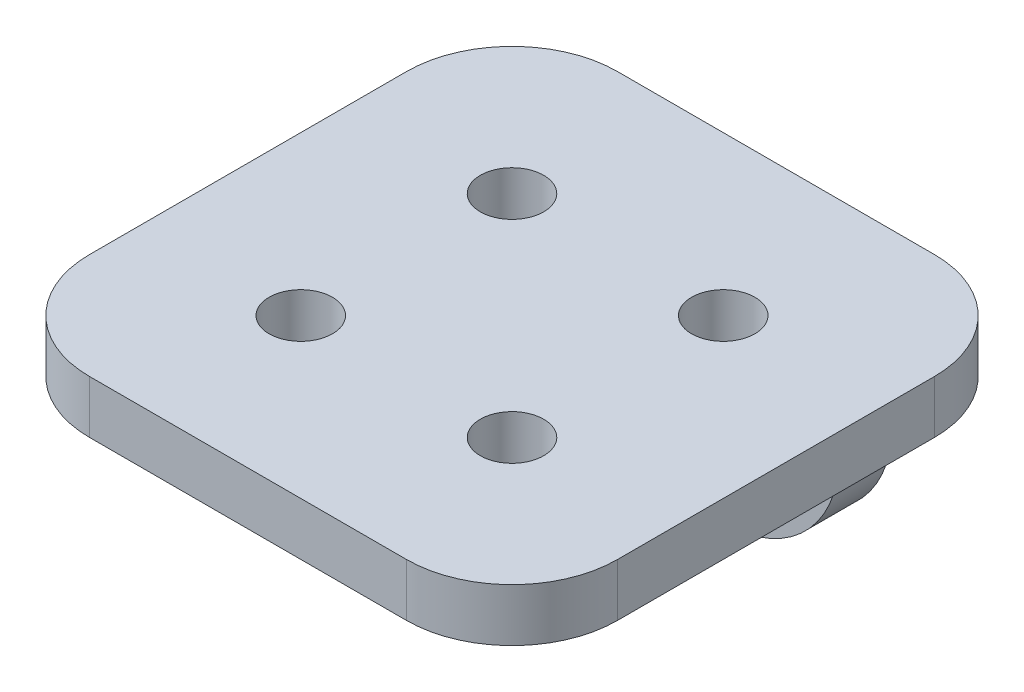
ISO-10303-21;
HEADER;
FILE_DESCRIPTION(('STEP AP214'),'2;1');
FILE_NAME('part.step','',(''),(''),'','','');
FILE_SCHEMA(('AUTOMOTIVE_DESIGN { 1 0 10303 214 1 1 1 1 }'));
ENDSEC;
DATA;
#1=APPLICATION_CONTEXT('core data for automotive mechanical design processes');
#2=APPLICATION_PROTOCOL_DEFINITION('international standard','automotive_design',2000,#1);
#3=PRODUCT_CONTEXT('',#1,'mechanical');
#4=PRODUCT('Part','Part','',(#3));
#5=PRODUCT_RELATED_PRODUCT_CATEGORY('part','',(#4));
#6=PRODUCT_DEFINITION_FORMATION('','',#4);
#7=PRODUCT_DEFINITION_CONTEXT('part definition',#1,'design');
#8=PRODUCT_DEFINITION('design','',#6,#7);
#9=PRODUCT_DEFINITION_SHAPE('','',#8);
#10=(LENGTH_UNIT() NAMED_UNIT(*) SI_UNIT(.MILLI.,.METRE.));
#11=(NAMED_UNIT(*) PLANE_ANGLE_UNIT() SI_UNIT($,.RADIAN.));
#12=(NAMED_UNIT(*) SI_UNIT($,.STERADIAN.) SOLID_ANGLE_UNIT());
#13=UNCERTAINTY_MEASURE_WITH_UNIT(LENGTH_MEASURE(1.E-05),#10,'distance_accuracy_value','');
#14=(GEOMETRIC_REPRESENTATION_CONTEXT(3) GLOBAL_UNCERTAINTY_ASSIGNED_CONTEXT((#13)) GLOBAL_UNIT_ASSIGNED_CONTEXT((#10,
#11,#12)) REPRESENTATION_CONTEXT('',''));
#15=CARTESIAN_POINT('',(0.,0.,0.));
#16=DIRECTION('',(0.,0.,1.));
#17=DIRECTION('',(1.,0.,0.));
#18=AXIS2_PLACEMENT_3D('',#15,#16,#17);
#19=CARTESIAN_POINT('',(0.,0.,5.));
#20=DIRECTION('',(0.,0.,-1.));
#21=DIRECTION('',(-1.,0.,0.));
#22=AXIS2_PLACEMENT_3D('',#19,#20,#21);
#23=CYLINDRICAL_SURFACE('',#22,5.);
#24=CARTESIAN_POINT('',(0.,0.,5.));
#25=DIRECTION('',(0.,0.,1.));
#26=DIRECTION('',(1.,0.,0.));
#27=AXIS2_PLACEMENT_3D('',#24,#25,#26);
#28=CIRCLE('',#27,5.);
#29=CARTESIAN_POINT('',(5.,0.,5.));
#30=VERTEX_POINT('',#29);
#31=EDGE_CURVE('E166',#30,#30,#28,.T.);
#32=ORIENTED_EDGE('',*,*,#31,.T.);
#33=EDGE_LOOP('',(#32));
#34=FACE_BOUND('',#33,.T.);
#35=CARTESIAN_POINT('',(0.,0.,0.));
#36=DIRECTION('',(0.,0.,1.));
#37=DIRECTION('',(1.,0.,0.));
#38=AXIS2_PLACEMENT_3D('',#35,#36,#37);
#39=CIRCLE('',#38,5.);
#40=CARTESIAN_POINT('',(5.,0.,0.));
#41=VERTEX_POINT('',#40);
#42=EDGE_CURVE('E242',#41,#41,#39,.T.);
#43=ORIENTED_EDGE('',*,*,#42,.F.);
#44=EDGE_LOOP('',(#43));
#45=FACE_BOUND('',#44,.T.);
#46=ADVANCED_FACE('F41',(#34,#45),#23,.F.);
#47=CARTESIAN_POINT('',(0.,8.,5.));
#48=DIRECTION('',(0.,0.,-1.));
#49=DIRECTION('',(-1.,0.,0.));
#50=AXIS2_PLACEMENT_3D('',#47,#48,#49);
#51=CYLINDRICAL_SURFACE('',#50,2.);
#52=CARTESIAN_POINT('',(0.,8.,5.));
#53=DIRECTION('',(0.,0.,1.));
#54=DIRECTION('',(1.,0.,0.));
#55=AXIS2_PLACEMENT_3D('',#52,#53,#54);
#56=CIRCLE('',#55,2.);
#57=CARTESIAN_POINT('',(2.,8.,5.));
#58=VERTEX_POINT('',#57);
#59=EDGE_CURVE('E220',#58,#58,#56,.T.);
#60=ORIENTED_EDGE('',*,*,#59,.T.);
#61=EDGE_LOOP('',(#60));
#62=FACE_BOUND('',#61,.T.);
#63=CARTESIAN_POINT('',(0.,8.,0.));
#64=DIRECTION('',(0.,0.,1.));
#65=DIRECTION('',(1.,0.,0.));
#66=AXIS2_PLACEMENT_3D('',#63,#64,#65);
#67=CIRCLE('',#66,2.);
#68=CARTESIAN_POINT('',(2.,8.,0.));
#69=VERTEX_POINT('',#68);
#70=EDGE_CURVE('E238',#69,#69,#67,.T.);
#71=ORIENTED_EDGE('',*,*,#70,.F.);
#72=EDGE_LOOP('',(#71));
#73=FACE_BOUND('',#72,.T.);
#74=ADVANCED_FACE('F361',(#62,#73),#51,.F.);
#75=CARTESIAN_POINT('',(8.,0.,5.));
#76=DIRECTION('',(0.,0.,-1.));
#77=DIRECTION('',(-1.,0.,0.));
#78=AXIS2_PLACEMENT_3D('',#75,#76,#77);
#79=CYLINDRICAL_SURFACE('',#78,2.00000000000003);
#80=CARTESIAN_POINT('',(8.,0.,5.));
#81=DIRECTION('',(0.,0.,1.));
#82=DIRECTION('',(1.,0.,0.));
#83=AXIS2_PLACEMENT_3D('',#80,#81,#82);
#84=CIRCLE('',#83,2.00000000000003);
#85=CARTESIAN_POINT('',(10.,0.,5.));
#86=VERTEX_POINT('',#85);
#87=EDGE_CURVE('E216',#86,#86,#84,.T.);
#88=ORIENTED_EDGE('',*,*,#87,.T.);
#89=EDGE_LOOP('',(#88));
#90=FACE_BOUND('',#89,.T.);
#91=CARTESIAN_POINT('',(8.,0.,0.));
#92=DIRECTION('',(0.,0.,1.));
#93=DIRECTION('',(1.,0.,0.));
#94=AXIS2_PLACEMENT_3D('',#91,#92,#93);
#95=CIRCLE('',#94,2.00000000000003);
#96=CARTESIAN_POINT('',(10.,0.,0.));
#97=VERTEX_POINT('',#96);
#98=EDGE_CURVE('E234',#97,#97,#95,.T.);
#99=ORIENTED_EDGE('',*,*,#98,.F.);
#100=EDGE_LOOP('',(#99));
#101=FACE_BOUND('',#100,.T.);
#102=ADVANCED_FACE('F367',(#90,#101),#79,.F.);
#103=CARTESIAN_POINT('',(0.,-8.,5.));
#104=DIRECTION('',(0.,0.,-1.));
#105=DIRECTION('',(-1.,0.,0.));
#106=AXIS2_PLACEMENT_3D('',#103,#104,#105);
#107=CYLINDRICAL_SURFACE('',#106,2.00000000000005);
#108=CARTESIAN_POINT('',(0.,-8.,5.));
#109=DIRECTION('',(0.,0.,1.));
#110=DIRECTION('',(1.,0.,0.));
#111=AXIS2_PLACEMENT_3D('',#108,#109,#110);
#112=CIRCLE('',#111,2.00000000000005);
#113=CARTESIAN_POINT('',(2.00000000000006,-8.,5.));
#114=VERTEX_POINT('',#113);
#115=EDGE_CURVE('E211',#114,#114,#112,.T.);
#116=ORIENTED_EDGE('',*,*,#115,.T.);
#117=EDGE_LOOP('',(#116));
#118=FACE_BOUND('',#117,.T.);
#119=CARTESIAN_POINT('',(0.,-8.,0.));
#120=DIRECTION('',(0.,0.,1.));
#121=DIRECTION('',(1.,0.,0.));
#122=AXIS2_PLACEMENT_3D('',#119,#120,#121);
#123=CIRCLE('',#122,2.00000000000005);
#124=CARTESIAN_POINT('',(2.00000000000006,-8.,0.));
#125=VERTEX_POINT('',#124);
#126=EDGE_CURVE('E230',#125,#125,#123,.T.);
#127=ORIENTED_EDGE('',*,*,#126,.F.);
#128=EDGE_LOOP('',(#127));
#129=FACE_BOUND('',#128,.T.);
#130=ADVANCED_FACE('F377',(#118,#129),#107,.F.);
#131=CARTESIAN_POINT('',(-8.,0.,5.));
#132=DIRECTION('',(0.,0.,-1.));
#133=DIRECTION('',(-1.,0.,0.));
#134=AXIS2_PLACEMENT_3D('',#131,#132,#133);
#135=CYLINDRICAL_SURFACE('',#134,2.00000000000008);
#136=CARTESIAN_POINT('',(-8.,0.,5.));
#137=DIRECTION('',(0.,0.,1.));
#138=DIRECTION('',(1.,0.,0.));
#139=AXIS2_PLACEMENT_3D('',#136,#137,#138);
#140=CIRCLE('',#139,2.00000000000008);
#141=CARTESIAN_POINT('',(-5.99999999999992,0.,5.));
#142=VERTEX_POINT('',#141);
#143=EDGE_CURVE('E207',#142,#142,#140,.T.);
#144=ORIENTED_EDGE('',*,*,#143,.T.);
#145=EDGE_LOOP('',(#144));
#146=FACE_BOUND('',#145,.T.);
#147=CARTESIAN_POINT('',(-8.,0.,0.));
#148=DIRECTION('',(0.,0.,1.));
#149=DIRECTION('',(1.,0.,0.));
#150=AXIS2_PLACEMENT_3D('',#147,#148,#149);
#151=CIRCLE('',#150,2.00000000000008);
#152=CARTESIAN_POINT('',(-5.99999999999992,0.,0.));
#153=VERTEX_POINT('',#152);
#154=EDGE_CURVE('E206',#153,#153,#151,.T.);
#155=ORIENTED_EDGE('',*,*,#154,.F.);
#156=EDGE_LOOP('',(#155));
#157=FACE_BOUND('',#156,.T.);
#158=ADVANCED_FACE('F381',(#146,#157),#135,.F.);
#159=CARTESIAN_POINT('',(0.,0.,5.));
#160=DIRECTION('',(0.,0.,-1.));
#161=DIRECTION('',(-1.,0.,0.));
#162=AXIS2_PLACEMENT_3D('',#159,#160,#161);
#163=CYLINDRICAL_SURFACE('',#162,11.);
#164=CARTESIAN_POINT('',(0.,0.,0.));
#165=DIRECTION('',(0.,0.,1.));
#166=DIRECTION('',(1.,0.,0.));
#167=AXIS2_PLACEMENT_3D('',#164,#165,#166);
#168=CIRCLE('',#167,11.);
#169=CARTESIAN_POINT('',(-11.,0.,0.));
#170=VERTEX_POINT('',#169);
#171=CARTESIAN_POINT('',(11.,0.,0.));
#172=VERTEX_POINT('',#171);
#173=EDGE_CURVE('E212',#170,#172,#168,.T.);
#174=ORIENTED_EDGE('',*,*,#173,.T.);
#175=DIRECTION('',(0.,0.,-1.));
#176=VECTOR('',#175,1.);
#177=CARTESIAN_POINT('',(11.,0.,5.));
#178=LINE('',#177,#176);
#179=CARTESIAN_POINT('',(11.,0.,5.));
#180=VERTEX_POINT('',#179);
#181=EDGE_CURVE('E139',#180,#172,#178,.T.);
#182=ORIENTED_EDGE('',*,*,#181,.F.);
#183=CARTESIAN_POINT('',(0.,0.,5.));
#184=DIRECTION('',(0.,0.,1.));
#185=DIRECTION('',(1.,0.,0.));
#186=AXIS2_PLACEMENT_3D('',#183,#184,#185);
#187=CIRCLE('',#186,11.);
#188=CARTESIAN_POINT('',(-11.,0.,5.));
#189=VERTEX_POINT('',#188);
#190=EDGE_CURVE('E149',#189,#180,#187,.T.);
#191=ORIENTED_EDGE('',*,*,#190,.F.);
#192=DIRECTION('',(0.,0.,-1.));
#193=VECTOR('',#192,1.);
#194=CARTESIAN_POINT('',(-11.,0.,5.));
#195=LINE('',#194,#193);
#196=EDGE_CURVE('E174',#189,#170,#195,.T.);
#197=ORIENTED_EDGE('',*,*,#196,.T.);
#198=EDGE_LOOP('',(#174,#182,#191,#197));
#199=FACE_BOUND('',#198,.T.);
#200=ADVANCED_FACE('F372',(#199),#163,.T.);
#201=CARTESIAN_POINT('',(0.,0.,5.));
#202=DIRECTION('',(0.,0.,1.));
#203=DIRECTION('',(1.,0.,0.));
#204=AXIS2_PLACEMENT_3D('',#201,#202,#203);
#205=PLANE('',#204);
#206=DIRECTION('',(1.,0.,0.));
#207=VECTOR('',#206,1.);
#208=CARTESIAN_POINT('',(25.,11.,5.));
#209=LINE('',#208,#207);
#210=CARTESIAN_POINT('',(-15.,11.,5.));
#211=VERTEX_POINT('',#210);
#212=CARTESIAN_POINT('',(15.,11.,5.));
#213=VERTEX_POINT('',#212);
#214=EDGE_CURVE('E147',#211,#213,#209,.T.);
#215=ORIENTED_EDGE('',*,*,#214,.F.);
#216=DIRECTION('',(0.341743063086705,-0.939793423488437,0.));
#217=VECTOR('',#216,1.);
#218=CARTESIAN_POINT('',(-9.71532846715328,-3.53284671532847,5.));
#219=LINE('',#218,#217);
#220=EDGE_CURVE('E151',#211,#189,#219,.T.);
#221=ORIENTED_EDGE('',*,*,#220,.T.);
#222=ORIENTED_EDGE('',*,*,#190,.T.);
#223=DIRECTION('',(-0.341743063086704,-0.939793423488437,0.));
#224=VECTOR('',#223,1.);
#225=CARTESIAN_POINT('',(9.71532846715328,-3.53284671532847,5.));
#226=LINE('',#225,#224);
#227=EDGE_CURVE('E133',#213,#180,#226,.T.);
#228=ORIENTED_EDGE('',*,*,#227,.F.);
#229=EDGE_LOOP('',(#215,#221,#222,#228));
#230=FACE_BOUND('',#229,.T.);
#231=ORIENTED_EDGE('',*,*,#143,.F.);
#232=EDGE_LOOP('',(#231));
#233=FACE_BOUND('',#232,.T.);
#234=ORIENTED_EDGE('',*,*,#115,.F.);
#235=EDGE_LOOP('',(#234));
#236=FACE_BOUND('',#235,.T.);
#237=ORIENTED_EDGE('',*,*,#87,.F.);
#238=EDGE_LOOP('',(#237));
#239=FACE_BOUND('',#238,.T.);
#240=ORIENTED_EDGE('',*,*,#59,.F.);
#241=EDGE_LOOP('',(#240));
#242=FACE_BOUND('',#241,.T.);
#243=ORIENTED_EDGE('',*,*,#31,.F.);
#244=EDGE_LOOP('',(#243));
#245=FACE_BOUND('',#244,.T.);
#246=ADVANCED_FACE('F144',(#230,#233,#236,#239,#242,#245),#205,.T.);
#247=CARTESIAN_POINT('',(0.,0.,0.));
#248=DIRECTION('',(0.,0.,1.));
#249=DIRECTION('',(1.,0.,0.));
#250=AXIS2_PLACEMENT_3D('',#247,#248,#249);
#251=PLANE('',#250);
#252=ORIENTED_EDGE('',*,*,#154,.T.);
#253=EDGE_LOOP('',(#252));
#254=FACE_BOUND('',#253,.T.);
#255=ORIENTED_EDGE('',*,*,#126,.T.);
#256=EDGE_LOOP('',(#255));
#257=FACE_BOUND('',#256,.T.);
#258=ORIENTED_EDGE('',*,*,#98,.T.);
#259=EDGE_LOOP('',(#258));
#260=FACE_BOUND('',#259,.T.);
#261=ORIENTED_EDGE('',*,*,#70,.T.);
#262=EDGE_LOOP('',(#261));
#263=FACE_BOUND('',#262,.T.);
#264=ORIENTED_EDGE('',*,*,#42,.T.);
#265=EDGE_LOOP('',(#264));
#266=FACE_BOUND('',#265,.T.);
#267=DIRECTION('',(1.,0.,0.));
#268=VECTOR('',#267,1.);
#269=CARTESIAN_POINT('',(0.,16.,0.));
#270=LINE('',#269,#268);
#271=CARTESIAN_POINT('',(-15.,16.,0.));
#272=VERTEX_POINT('',#271);
#273=CARTESIAN_POINT('',(15.,16.,0.));
#274=VERTEX_POINT('',#273);
#275=EDGE_CURVE('E177',#272,#274,#270,.T.);
#276=ORIENTED_EDGE('',*,*,#275,.T.);
#277=DIRECTION('',(0.,-1.,0.));
#278=VECTOR('',#277,1.);
#279=CARTESIAN_POINT('',(15.,11.,0.));
#280=LINE('',#279,#278);
#281=CARTESIAN_POINT('',(15.,11.,0.));
#282=VERTEX_POINT('',#281);
#283=EDGE_CURVE('E164',#274,#282,#280,.T.);
#284=ORIENTED_EDGE('',*,*,#283,.T.);
#285=DIRECTION('',(-0.341743063086704,-0.939793423488437,0.));
#286=VECTOR('',#285,1.);
#287=CARTESIAN_POINT('',(9.71532846715328,-3.53284671532847,0.));
#288=LINE('',#287,#286);
#289=EDGE_CURVE('E135',#282,#172,#288,.T.);
#290=ORIENTED_EDGE('',*,*,#289,.T.);
#291=ORIENTED_EDGE('',*,*,#173,.F.);
#292=DIRECTION('',(0.341743063086705,-0.939793423488437,0.));
#293=VECTOR('',#292,1.);
#294=CARTESIAN_POINT('',(-9.71532846715328,-3.53284671532847,0.));
#295=LINE('',#294,#293);
#296=CARTESIAN_POINT('',(-15.,11.,0.));
#297=VERTEX_POINT('',#296);
#298=EDGE_CURVE('E152',#297,#170,#295,.T.);
#299=ORIENTED_EDGE('',*,*,#298,.F.);
#300=DIRECTION('',(0.,1.,0.));
#301=VECTOR('',#300,1.);
#302=CARTESIAN_POINT('',(-15.,16.,0.));
#303=LINE('',#302,#301);
#304=EDGE_CURVE('E159',#297,#272,#303,.T.);
#305=ORIENTED_EDGE('',*,*,#304,.T.);
#306=EDGE_LOOP('',(#276,#284,#290,#291,#299,#305));
#307=FACE_BOUND('',#306,.T.);
#308=ADVANCED_FACE('F356',(#254,#257,#260,#263,#266,#307),#251,.F.);
#309=CARTESIAN_POINT('',(9.71532846715328,-3.53284671532847,5.));
#310=DIRECTION('',(0.939793423488437,-0.341743063086704,0.));
#311=DIRECTION('',(0.341743063086704,0.939793423488437,0.));
#312=AXIS2_PLACEMENT_3D('',#309,#310,#311);
#313=PLANE('',#312);
#314=ORIENTED_EDGE('',*,*,#289,.F.);
#315=DIRECTION('',(0.,0.,-1.));
#316=VECTOR('',#315,1.);
#317=CARTESIAN_POINT('',(15.,11.,5.));
#318=LINE('',#317,#316);
#319=EDGE_CURVE('E129',#213,#282,#318,.T.);
#320=ORIENTED_EDGE('',*,*,#319,.F.);
#321=ORIENTED_EDGE('',*,*,#227,.T.);
#322=ORIENTED_EDGE('',*,*,#181,.T.);
#323=EDGE_LOOP('',(#314,#320,#321,#322));
#324=FACE_BOUND('',#323,.T.);
#325=ADVANCED_FACE('F131',(#324),#313,.T.);
#326=CARTESIAN_POINT('',(0.,11.,5.));
#327=DIRECTION('',(0.,1.,0.));
#328=DIRECTION('',(0.,0.,1.));
#329=AXIS2_PLACEMENT_3D('',#326,#327,#328);
#330=PLANE('',#329);
#331=CARTESIAN_POINT('',(10.,11.,15.));
#332=DIRECTION('',(0.,1.,0.));
#333=DIRECTION('',(0.,0.,1.));
#334=AXIS2_PLACEMENT_3D('',#331,#332,#333);
#335=CIRCLE('',#334,3.);
#336=CARTESIAN_POINT('',(10.,11.,18.));
#337=VERTEX_POINT('',#336);
#338=EDGE_CURVE('E306',#337,#337,#335,.F.);
#339=ORIENTED_EDGE('',*,*,#338,.F.);
#340=EDGE_LOOP('',(#339));
#341=FACE_BOUND('',#340,.T.);
#342=CARTESIAN_POINT('',(-10.,11.,15.));
#343=DIRECTION('',(0.,1.,0.));
#344=DIRECTION('',(0.,0.,1.));
#345=AXIS2_PLACEMENT_3D('',#342,#343,#344);
#346=CIRCLE('',#345,3.);
#347=CARTESIAN_POINT('',(-10.,11.,18.));
#348=VERTEX_POINT('',#347);
#349=EDGE_CURVE('E315',#348,#348,#346,.F.);
#350=ORIENTED_EDGE('',*,*,#349,.F.);
#351=EDGE_LOOP('',(#350));
#352=FACE_BOUND('',#351,.T.);
#353=CARTESIAN_POINT('',(-10.,11.,35.));
#354=DIRECTION('',(0.,1.,0.));
#355=DIRECTION('',(0.,0.,1.));
#356=AXIS2_PLACEMENT_3D('',#353,#354,#355);
#357=CIRCLE('',#356,3.);
#358=CARTESIAN_POINT('',(-10.,11.,38.));
#359=VERTEX_POINT('',#358);
#360=EDGE_CURVE('E305',#359,#359,#357,.F.);
#361=ORIENTED_EDGE('',*,*,#360,.F.);
#362=EDGE_LOOP('',(#361));
#363=FACE_BOUND('',#362,.T.);
#364=CARTESIAN_POINT('',(10.,11.,35.));
#365=DIRECTION('',(0.,1.,0.));
#366=DIRECTION('',(0.,0.,1.));
#367=AXIS2_PLACEMENT_3D('',#364,#365,#366);
#368=CIRCLE('',#367,3.);
#369=CARTESIAN_POINT('',(10.,11.,38.));
#370=VERTEX_POINT('',#369);
#371=EDGE_CURVE('E296',#370,#370,#368,.F.);
#372=ORIENTED_EDGE('',*,*,#371,.F.);
#373=EDGE_LOOP('',(#372));
#374=FACE_BOUND('',#373,.T.);
#375=ORIENTED_EDGE('',*,*,#319,.T.);
#376=CARTESIAN_POINT('',(15.,11.,10.));
#377=DIRECTION('',(0.,1.,0.));
#378=DIRECTION('',(0.,0.,1.));
#379=AXIS2_PLACEMENT_3D('',#376,#377,#378);
#380=CIRCLE('',#379,10.);
#381=CARTESIAN_POINT('',(25.,11.,10.));
#382=VERTEX_POINT('',#381);
#383=EDGE_CURVE('E260',#282,#382,#380,.F.);
#384=ORIENTED_EDGE('',*,*,#383,.T.);
#385=DIRECTION('',(0.,0.,-1.));
#386=VECTOR('',#385,1.);
#387=CARTESIAN_POINT('',(25.,11.,5.));
#388=LINE('',#387,#386);
#389=CARTESIAN_POINT('',(25.,11.,40.));
#390=VERTEX_POINT('',#389);
#391=EDGE_CURVE('E140',#390,#382,#388,.T.);
#392=ORIENTED_EDGE('',*,*,#391,.F.);
#393=CARTESIAN_POINT('',(15.,11.,40.));
#394=DIRECTION('',(0.,1.,0.));
#395=DIRECTION('',(0.,0.,1.));
#396=AXIS2_PLACEMENT_3D('',#393,#394,#395);
#397=CIRCLE('',#396,10.);
#398=CARTESIAN_POINT('',(15.,11.,50.));
#399=VERTEX_POINT('',#398);
#400=EDGE_CURVE('E251',#390,#399,#397,.F.);
#401=ORIENTED_EDGE('',*,*,#400,.T.);
#402=DIRECTION('',(1.,0.,0.));
#403=VECTOR('',#402,1.);
#404=CARTESIAN_POINT('',(25.,11.,50.));
#405=LINE('',#404,#403);
#406=CARTESIAN_POINT('',(-15.,11.,50.));
#407=VERTEX_POINT('',#406);
#408=EDGE_CURVE('E290',#407,#399,#405,.T.);
#409=ORIENTED_EDGE('',*,*,#408,.F.);
#410=CARTESIAN_POINT('',(-15.,11.,40.));
#411=DIRECTION('',(0.,1.,0.));
#412=DIRECTION('',(0.,0.,1.));
#413=AXIS2_PLACEMENT_3D('',#410,#411,#412);
#414=CIRCLE('',#413,10.);
#415=CARTESIAN_POINT('',(-25.,11.,40.));
#416=VERTEX_POINT('',#415);
#417=EDGE_CURVE('E254',#407,#416,#414,.F.);
#418=ORIENTED_EDGE('',*,*,#417,.T.);
#419=DIRECTION('',(0.,0.,-1.));
#420=VECTOR('',#419,1.);
#421=CARTESIAN_POINT('',(-25.,11.,5.));
#422=LINE('',#421,#420);
#423=CARTESIAN_POINT('',(-25.,11.,10.));
#424=VERTEX_POINT('',#423);
#425=EDGE_CURVE('E189',#416,#424,#422,.T.);
#426=ORIENTED_EDGE('',*,*,#425,.T.);
#427=CARTESIAN_POINT('',(-15.,11.,10.));
#428=DIRECTION('',(0.,1.,0.));
#429=DIRECTION('',(0.,0.,1.));
#430=AXIS2_PLACEMENT_3D('',#427,#428,#429);
#431=CIRCLE('',#430,10.);
#432=EDGE_CURVE('E257',#424,#297,#431,.F.);
#433=ORIENTED_EDGE('',*,*,#432,.T.);
#434=DIRECTION('',(0.,0.,-1.));
#435=VECTOR('',#434,1.);
#436=CARTESIAN_POINT('',(-15.,11.,5.));
#437=LINE('',#436,#435);
#438=EDGE_CURVE('E156',#211,#297,#437,.T.);
#439=ORIENTED_EDGE('',*,*,#438,.F.);
#440=ORIENTED_EDGE('',*,*,#214,.T.);
#441=EDGE_LOOP('',(#375,#384,#392,#401,#409,#418,#426,#433,#439,#440));
#442=FACE_BOUND('',#441,.T.);
#443=ADVANCED_FACE('F154',(#341,#352,#363,#374,#442),#330,.F.);
#444=CARTESIAN_POINT('',(25.,0.,5.));
#445=DIRECTION('',(1.,0.,0.));
#446=DIRECTION('',(0.,0.,-1.));
#447=AXIS2_PLACEMENT_3D('',#444,#445,#446);
#448=PLANE('',#447);
#449=ORIENTED_EDGE('',*,*,#391,.T.);
#450=DIRECTION('',(0.,-1.,0.));
#451=VECTOR('',#450,1.);
#452=CARTESIAN_POINT('',(25.,16.,10.));
#453=LINE('',#452,#451);
#454=CARTESIAN_POINT('',(25.,16.,10.));
#455=VERTEX_POINT('',#454);
#456=EDGE_CURVE('E266',#382,#455,#453,.F.);
#457=ORIENTED_EDGE('',*,*,#456,.T.);
#458=DIRECTION('',(0.,0.,-1.));
#459=VECTOR('',#458,1.);
#460=CARTESIAN_POINT('',(25.,16.,5.));
#461=LINE('',#460,#459);
#462=CARTESIAN_POINT('',(25.,16.,40.));
#463=VERTEX_POINT('',#462);
#464=EDGE_CURVE('E197',#463,#455,#461,.T.);
#465=ORIENTED_EDGE('',*,*,#464,.F.);
#466=DIRECTION('',(0.,1.,0.));
#467=VECTOR('',#466,1.);
#468=CARTESIAN_POINT('',(25.,11.,40.));
#469=LINE('',#468,#467);
#470=EDGE_CURVE('E263',#463,#390,#469,.F.);
#471=ORIENTED_EDGE('',*,*,#470,.T.);
#472=EDGE_LOOP('',(#449,#457,#465,#471));
#473=FACE_BOUND('',#472,.T.);
#474=ADVANCED_FACE('F336',(#473),#448,.T.);
#475=CARTESIAN_POINT('',(0.,16.,5.));
#476=DIRECTION('',(0.,1.,0.));
#477=DIRECTION('',(0.,0.,1.));
#478=AXIS2_PLACEMENT_3D('',#475,#476,#477);
#479=PLANE('',#478);
#480=CARTESIAN_POINT('',(10.,16.,15.));
#481=DIRECTION('',(0.,1.,0.));
#482=DIRECTION('',(0.,0.,1.));
#483=AXIS2_PLACEMENT_3D('',#480,#481,#482);
#484=CIRCLE('',#483,3.);
#485=CARTESIAN_POINT('',(10.,16.,18.));
#486=VERTEX_POINT('',#485);
#487=EDGE_CURVE('E311',#486,#486,#484,.T.);
#488=ORIENTED_EDGE('',*,*,#487,.F.);
#489=EDGE_LOOP('',(#488));
#490=FACE_BOUND('',#489,.T.);
#491=CARTESIAN_POINT('',(-10.,16.,15.));
#492=DIRECTION('',(0.,1.,0.));
#493=DIRECTION('',(0.,0.,1.));
#494=AXIS2_PLACEMENT_3D('',#491,#492,#493);
#495=CIRCLE('',#494,3.);
#496=CARTESIAN_POINT('',(-10.,16.,18.));
#497=VERTEX_POINT('',#496);
#498=EDGE_CURVE('E310',#497,#497,#495,.T.);
#499=ORIENTED_EDGE('',*,*,#498,.F.);
#500=EDGE_LOOP('',(#499));
#501=FACE_BOUND('',#500,.T.);
#502=CARTESIAN_POINT('',(-10.,16.,35.));
#503=DIRECTION('',(0.,1.,0.));
#504=DIRECTION('',(0.,0.,1.));
#505=AXIS2_PLACEMENT_3D('',#502,#503,#504);
#506=CIRCLE('',#505,3.);
#507=CARTESIAN_POINT('',(-10.,16.,38.));
#508=VERTEX_POINT('',#507);
#509=EDGE_CURVE('E319',#508,#508,#506,.T.);
#510=ORIENTED_EDGE('',*,*,#509,.F.);
#511=EDGE_LOOP('',(#510));
#512=FACE_BOUND('',#511,.T.);
#513=CARTESIAN_POINT('',(10.,16.,35.));
#514=DIRECTION('',(0.,1.,0.));
#515=DIRECTION('',(0.,0.,1.));
#516=AXIS2_PLACEMENT_3D('',#513,#514,#515);
#517=CIRCLE('',#516,3.);
#518=CARTESIAN_POINT('',(10.,16.,38.));
#519=VERTEX_POINT('',#518);
#520=EDGE_CURVE('E299',#519,#519,#517,.T.);
#521=ORIENTED_EDGE('',*,*,#520,.F.);
#522=EDGE_LOOP('',(#521));
#523=FACE_BOUND('',#522,.T.);
#524=ORIENTED_EDGE('',*,*,#464,.T.);
#525=CARTESIAN_POINT('',(15.,16.,10.));
#526=DIRECTION('',(0.,1.,0.));
#527=DIRECTION('',(0.,0.,1.));
#528=AXIS2_PLACEMENT_3D('',#525,#526,#527);
#529=CIRCLE('',#528,10.);
#530=EDGE_CURVE('E276',#455,#274,#529,.T.);
#531=ORIENTED_EDGE('',*,*,#530,.T.);
#532=ORIENTED_EDGE('',*,*,#275,.F.);
#533=CARTESIAN_POINT('',(-15.,16.,10.));
#534=DIRECTION('',(0.,1.,0.));
#535=DIRECTION('',(0.,0.,1.));
#536=AXIS2_PLACEMENT_3D('',#533,#534,#535);
#537=CIRCLE('',#536,10.);
#538=CARTESIAN_POINT('',(-25.,16.,10.));
#539=VERTEX_POINT('',#538);
#540=EDGE_CURVE('E273',#272,#539,#537,.T.);
#541=ORIENTED_EDGE('',*,*,#540,.T.);
#542=DIRECTION('',(0.,0.,-1.));
#543=VECTOR('',#542,1.);
#544=CARTESIAN_POINT('',(-25.,16.,5.));
#545=LINE('',#544,#543);
#546=CARTESIAN_POINT('',(-25.,16.,40.));
#547=VERTEX_POINT('',#546);
#548=EDGE_CURVE('E193',#547,#539,#545,.T.);
#549=ORIENTED_EDGE('',*,*,#548,.F.);
#550=CARTESIAN_POINT('',(-15.,16.,40.));
#551=DIRECTION('',(0.,1.,0.));
#552=DIRECTION('',(0.,0.,1.));
#553=AXIS2_PLACEMENT_3D('',#550,#551,#552);
#554=CIRCLE('',#553,10.);
#555=CARTESIAN_POINT('',(-15.,16.,50.));
#556=VERTEX_POINT('',#555);
#557=EDGE_CURVE('E57',#547,#556,#554,.T.);
#558=ORIENTED_EDGE('',*,*,#557,.T.);
#559=DIRECTION('',(-1.,0.,0.));
#560=VECTOR('',#559,1.);
#561=CARTESIAN_POINT('',(-25.,16.,50.));
#562=LINE('',#561,#560);
#563=CARTESIAN_POINT('',(15.,16.,50.));
#564=VERTEX_POINT('',#563);
#565=EDGE_CURVE('E169',#564,#556,#562,.T.);
#566=ORIENTED_EDGE('',*,*,#565,.F.);
#567=CARTESIAN_POINT('',(15.,16.,40.));
#568=DIRECTION('',(0.,1.,0.));
#569=DIRECTION('',(0.,0.,1.));
#570=AXIS2_PLACEMENT_3D('',#567,#568,#569);
#571=CIRCLE('',#570,10.);
#572=EDGE_CURVE('E65',#564,#463,#571,.T.);
#573=ORIENTED_EDGE('',*,*,#572,.T.);
#574=EDGE_LOOP('',(#524,#531,#532,#541,#549,#558,#566,#573));
#575=FACE_BOUND('',#574,.T.);
#576=ADVANCED_FACE('F292',(#490,#501,#512,#523,#575),#479,.T.);
#577=CARTESIAN_POINT('',(-25.,0.,5.));
#578=DIRECTION('',(-1.,0.,0.));
#579=DIRECTION('',(0.,0.,1.));
#580=AXIS2_PLACEMENT_3D('',#577,#578,#579);
#581=PLANE('',#580);
#582=ORIENTED_EDGE('',*,*,#548,.T.);
#583=DIRECTION('',(0.,1.,0.));
#584=VECTOR('',#583,1.);
#585=CARTESIAN_POINT('',(-25.,11.,10.));
#586=LINE('',#585,#584);
#587=EDGE_CURVE('E282',#539,#424,#586,.F.);
#588=ORIENTED_EDGE('',*,*,#587,.T.);
#589=ORIENTED_EDGE('',*,*,#425,.F.);
#590=DIRECTION('',(0.,-1.,0.));
#591=VECTOR('',#590,1.);
#592=CARTESIAN_POINT('',(-25.,16.,40.));
#593=LINE('',#592,#591);
#594=EDGE_CURVE('E279',#416,#547,#593,.F.);
#595=ORIENTED_EDGE('',*,*,#594,.T.);
#596=EDGE_LOOP('',(#582,#588,#589,#595));
#597=FACE_BOUND('',#596,.T.);
#598=ADVANCED_FACE('F335',(#597),#581,.T.);
#599=CARTESIAN_POINT('',(-9.71532846715328,-3.53284671532847,5.));
#600=DIRECTION('',(0.939793423488437,0.341743063086705,0.));
#601=DIRECTION('',(-0.341743063086705,0.939793423488437,0.));
#602=AXIS2_PLACEMENT_3D('',#599,#600,#601);
#603=PLANE('',#602);
#604=ORIENTED_EDGE('',*,*,#298,.T.);
#605=ORIENTED_EDGE('',*,*,#196,.F.);
#606=ORIENTED_EDGE('',*,*,#220,.F.);
#607=ORIENTED_EDGE('',*,*,#438,.T.);
#608=EDGE_LOOP('',(#604,#605,#606,#607));
#609=FACE_BOUND('',#608,.T.);
#610=ADVANCED_FACE('F414',(#609),#603,.F.);
#611=CARTESIAN_POINT('',(0.,0.,50.));
#612=DIRECTION('',(0.,0.,-1.));
#613=DIRECTION('',(-1.,0.,0.));
#614=AXIS2_PLACEMENT_3D('',#611,#612,#613);
#615=PLANE('',#614);
#616=ORIENTED_EDGE('',*,*,#565,.T.);
#617=DIRECTION('',(0.,-1.,0.));
#618=VECTOR('',#617,1.);
#619=CARTESIAN_POINT('',(-15.,11.,50.));
#620=LINE('',#619,#618);
#621=EDGE_CURVE('E11',#556,#407,#620,.T.);
#622=ORIENTED_EDGE('',*,*,#621,.T.);
#623=ORIENTED_EDGE('',*,*,#408,.T.);
#624=DIRECTION('',(0.,1.,0.));
#625=VECTOR('',#624,1.);
#626=CARTESIAN_POINT('',(15.,16.,50.));
#627=LINE('',#626,#625);
#628=EDGE_CURVE('E50',#399,#564,#627,.T.);
#629=ORIENTED_EDGE('',*,*,#628,.T.);
#630=EDGE_LOOP('',(#616,#622,#623,#629));
#631=FACE_BOUND('',#630,.T.);
#632=ADVANCED_FACE('F287',(#631),#615,.F.);
#633=CARTESIAN_POINT('',(10.,-11.001,35.));
#634=DIRECTION('',(0.,1.,0.));
#635=DIRECTION('',(0.,0.,1.));
#636=AXIS2_PLACEMENT_3D('',#633,#634,#635);
#637=CYLINDRICAL_SURFACE('',#636,3.);
#638=ORIENTED_EDGE('',*,*,#520,.T.);
#639=EDGE_LOOP('',(#638));
#640=FACE_BOUND('',#639,.T.);
#641=ORIENTED_EDGE('',*,*,#371,.T.);
#642=EDGE_LOOP('',(#641));
#643=FACE_BOUND('',#642,.T.);
#644=ADVANCED_FACE('F341',(#640,#643),#637,.F.);
#645=CARTESIAN_POINT('',(-10.,-11.001,35.));
#646=DIRECTION('',(0.,1.,0.));
#647=DIRECTION('',(0.,0.,1.));
#648=AXIS2_PLACEMENT_3D('',#645,#646,#647);
#649=CYLINDRICAL_SURFACE('',#648,3.);
#650=ORIENTED_EDGE('',*,*,#509,.T.);
#651=EDGE_LOOP('',(#650));
#652=FACE_BOUND('',#651,.T.);
#653=ORIENTED_EDGE('',*,*,#360,.T.);
#654=EDGE_LOOP('',(#653));
#655=FACE_BOUND('',#654,.T.);
#656=ADVANCED_FACE('F330',(#652,#655),#649,.F.);
#657=CARTESIAN_POINT('',(-10.,-11.001,15.));
#658=DIRECTION('',(0.,1.,0.));
#659=DIRECTION('',(0.,0.,1.));
#660=AXIS2_PLACEMENT_3D('',#657,#658,#659);
#661=CYLINDRICAL_SURFACE('',#660,3.);
#662=ORIENTED_EDGE('',*,*,#498,.T.);
#663=EDGE_LOOP('',(#662));
#664=FACE_BOUND('',#663,.T.);
#665=ORIENTED_EDGE('',*,*,#349,.T.);
#666=EDGE_LOOP('',(#665));
#667=FACE_BOUND('',#666,.T.);
#668=ADVANCED_FACE('F522',(#664,#667),#661,.F.);
#669=CARTESIAN_POINT('',(10.,-11.001,15.));
#670=DIRECTION('',(0.,1.,0.));
#671=DIRECTION('',(0.,0.,1.));
#672=AXIS2_PLACEMENT_3D('',#669,#670,#671);
#673=CYLINDRICAL_SURFACE('',#672,3.);
#674=ORIENTED_EDGE('',*,*,#487,.T.);
#675=EDGE_LOOP('',(#674));
#676=FACE_BOUND('',#675,.T.);
#677=ORIENTED_EDGE('',*,*,#338,.T.);
#678=EDGE_LOOP('',(#677));
#679=FACE_BOUND('',#678,.T.);
#680=ADVANCED_FACE('F390',(#676,#679),#673,.F.);
#681=CARTESIAN_POINT('',(15.,0.,10.));
#682=DIRECTION('',(0.,1.,0.));
#683=DIRECTION('',(0.,0.,1.));
#684=AXIS2_PLACEMENT_3D('',#681,#682,#683);
#685=CYLINDRICAL_SURFACE('',#684,10.);
#686=ORIENTED_EDGE('',*,*,#530,.F.);
#687=ORIENTED_EDGE('',*,*,#456,.F.);
#688=ORIENTED_EDGE('',*,*,#383,.F.);
#689=ORIENTED_EDGE('',*,*,#283,.F.);
#690=EDGE_LOOP('',(#686,#687,#688,#689));
#691=FACE_BOUND('',#690,.T.);
#692=ADVANCED_FACE('F386',(#691),#685,.T.);
#693=CARTESIAN_POINT('',(-15.,0.,10.));
#694=DIRECTION('',(0.,-1.,0.));
#695=DIRECTION('',(0.,0.,-1.));
#696=AXIS2_PLACEMENT_3D('',#693,#694,#695);
#697=CYLINDRICAL_SURFACE('',#696,10.);
#698=ORIENTED_EDGE('',*,*,#432,.F.);
#699=ORIENTED_EDGE('',*,*,#587,.F.);
#700=ORIENTED_EDGE('',*,*,#540,.F.);
#701=ORIENTED_EDGE('',*,*,#304,.F.);
#702=EDGE_LOOP('',(#698,#699,#700,#701));
#703=FACE_BOUND('',#702,.T.);
#704=ADVANCED_FACE('F389',(#703),#697,.T.);
#705=CARTESIAN_POINT('',(-15.,0.,40.));
#706=DIRECTION('',(0.,1.,0.));
#707=DIRECTION('',(0.,0.,1.));
#708=AXIS2_PLACEMENT_3D('',#705,#706,#707);
#709=CYLINDRICAL_SURFACE('',#708,10.);
#710=ORIENTED_EDGE('',*,*,#557,.F.);
#711=ORIENTED_EDGE('',*,*,#594,.F.);
#712=ORIENTED_EDGE('',*,*,#417,.F.);
#713=ORIENTED_EDGE('',*,*,#621,.F.);
#714=EDGE_LOOP('',(#710,#711,#712,#713));
#715=FACE_BOUND('',#714,.T.);
#716=ADVANCED_FACE('F393',(#715),#709,.T.);
#717=CARTESIAN_POINT('',(15.,0.,40.));
#718=DIRECTION('',(0.,-1.,0.));
#719=DIRECTION('',(0.,0.,-1.));
#720=AXIS2_PLACEMENT_3D('',#717,#718,#719);
#721=CYLINDRICAL_SURFACE('',#720,10.);
#722=ORIENTED_EDGE('',*,*,#400,.F.);
#723=ORIENTED_EDGE('',*,*,#470,.F.);
#724=ORIENTED_EDGE('',*,*,#572,.F.);
#725=ORIENTED_EDGE('',*,*,#628,.F.);
#726=EDGE_LOOP('',(#722,#723,#724,#725));
#727=FACE_BOUND('',#726,.T.);
#728=ADVANCED_FACE('F43',(#727),#721,.T.);
#729=CLOSED_SHELL('',(#46,#74,#102,#130,#158,#200,#246,#308,#325,#443,#474,#576,#598,#610,#632,
#644,#656,#668,#680,#692,#704,#716,#728));
#730=MANIFOLD_SOLID_BREP('B2',#729);
#731=ADVANCED_BREP_SHAPE_REPRESENTATION('',(#18,#730),#14);
#732=SHAPE_DEFINITION_REPRESENTATION(#9,#731);
ENDSEC;
END-ISO-10303-21;
